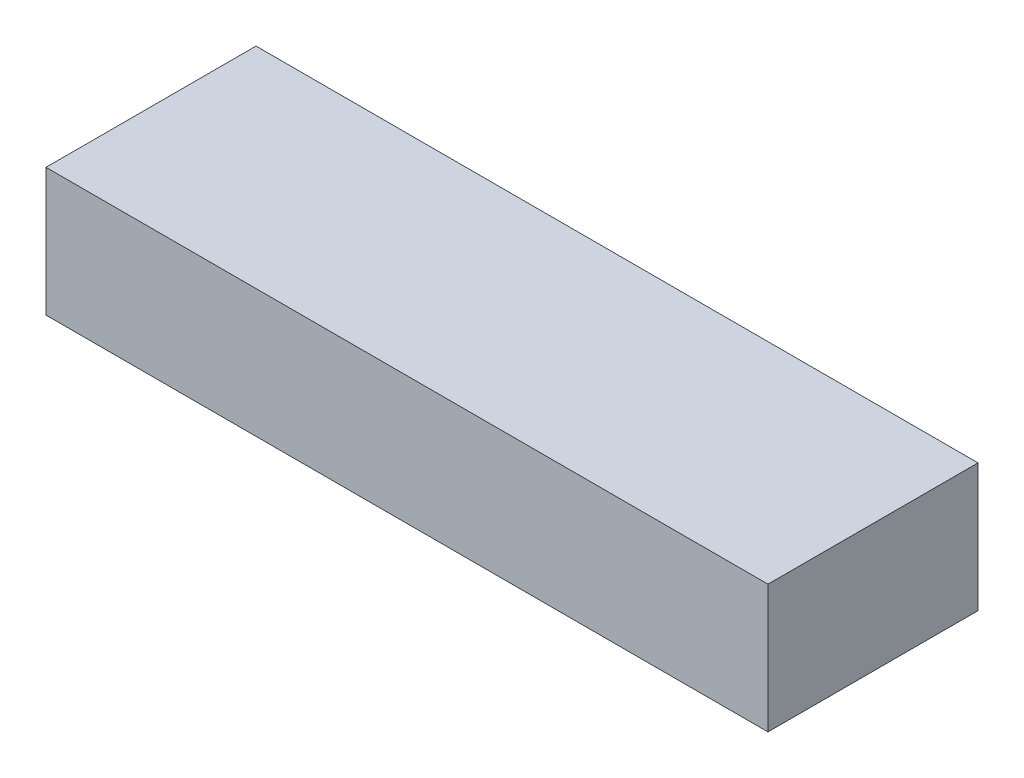
ISO-10303-21;
HEADER;
FILE_DESCRIPTION(('STEP AP214'),'2;1');
FILE_NAME('part.step','',(''),(''),'','','');
FILE_SCHEMA(('AUTOMOTIVE_DESIGN { 1 0 10303 214 1 1 1 1 }'));
ENDSEC;
DATA;
#1=APPLICATION_CONTEXT('core data for automotive mechanical design processes');
#2=APPLICATION_PROTOCOL_DEFINITION('international standard','automotive_design',2000,#1);
#3=PRODUCT_CONTEXT('',#1,'mechanical');
#4=PRODUCT('Part','Part','',(#3));
#5=PRODUCT_RELATED_PRODUCT_CATEGORY('part','',(#4));
#6=PRODUCT_DEFINITION_FORMATION('','',#4);
#7=PRODUCT_DEFINITION_CONTEXT('part definition',#1,'design');
#8=PRODUCT_DEFINITION('design','',#6,#7);
#9=PRODUCT_DEFINITION_SHAPE('','',#8);
#10=(LENGTH_UNIT() NAMED_UNIT(*) SI_UNIT(.MILLI.,.METRE.));
#11=(NAMED_UNIT(*) PLANE_ANGLE_UNIT() SI_UNIT($,.RADIAN.));
#12=(NAMED_UNIT(*) SI_UNIT($,.STERADIAN.) SOLID_ANGLE_UNIT());
#13=UNCERTAINTY_MEASURE_WITH_UNIT(LENGTH_MEASURE(1.E-05),#10,'distance_accuracy_value','');
#14=(GEOMETRIC_REPRESENTATION_CONTEXT(3) GLOBAL_UNCERTAINTY_ASSIGNED_CONTEXT((#13)) GLOBAL_UNIT_ASSIGNED_CONTEXT((#10,
#11,#12)) REPRESENTATION_CONTEXT('',''));
#15=CARTESIAN_POINT('',(0.,0.,0.));
#16=DIRECTION('',(0.,0.,1.));
#17=DIRECTION('',(1.,0.,0.));
#18=AXIS2_PLACEMENT_3D('',#15,#16,#17);
#19=CARTESIAN_POINT('',(0.,3.9,0.));
#20=DIRECTION('',(1.,0.,0.));
#21=DIRECTION('',(0.,0.,-1.));
#22=AXIS2_PLACEMENT_3D('',#19,#20,#21);
#23=PLANE('',#22);
#24=DIRECTION('',(0.,0.,1.));
#25=VECTOR('',#24,1.);
#26=CARTESIAN_POINT('',(0.,0.,0.));
#27=LINE('',#26,#25);
#28=CARTESIAN_POINT('',(0.,0.,-6.4));
#29=VERTEX_POINT('',#28);
#30=CARTESIAN_POINT('',(0.,0.,0.));
#31=VERTEX_POINT('',#30);
#32=EDGE_CURVE('E96',#29,#31,#27,.T.);
#33=ORIENTED_EDGE('',*,*,#32,.T.);
#34=DIRECTION('',(0.,-1.,0.));
#35=VECTOR('',#34,1.);
#36=CARTESIAN_POINT('',(0.,3.9,0.));
#37=LINE('',#36,#35);
#38=CARTESIAN_POINT('',(0.,3.9,0.));
#39=VERTEX_POINT('',#38);
#40=EDGE_CURVE('E11',#39,#31,#37,.T.);
#41=ORIENTED_EDGE('',*,*,#40,.F.);
#42=DIRECTION('',(0.,0.,1.));
#43=VECTOR('',#42,1.);
#44=CARTESIAN_POINT('',(0.,3.9,0.));
#45=LINE('',#44,#43);
#46=CARTESIAN_POINT('',(0.,3.9,-6.4));
#47=VERTEX_POINT('',#46);
#48=EDGE_CURVE('E84',#47,#39,#45,.T.);
#49=ORIENTED_EDGE('',*,*,#48,.F.);
#50=DIRECTION('',(0.,-1.,0.));
#51=VECTOR('',#50,1.);
#52=CARTESIAN_POINT('',(0.,3.9,-6.4));
#53=LINE('',#52,#51);
#54=EDGE_CURVE('E92',#47,#29,#53,.T.);
#55=ORIENTED_EDGE('',*,*,#54,.T.);
#56=EDGE_LOOP('',(#33,#41,#49,#55));
#57=FACE_BOUND('',#56,.T.);
#58=ADVANCED_FACE('F33',(#57),#23,.F.);
#59=CARTESIAN_POINT('',(0.,3.9,0.));
#60=DIRECTION('',(0.,0.,-1.));
#61=DIRECTION('',(-1.,0.,0.));
#62=AXIS2_PLACEMENT_3D('',#59,#60,#61);
#63=PLANE('',#62);
#64=DIRECTION('',(1.,0.,0.));
#65=VECTOR('',#64,1.);
#66=CARTESIAN_POINT('',(0.,0.,0.));
#67=LINE('',#66,#65);
#68=CARTESIAN_POINT('',(22.,0.,0.));
#69=VERTEX_POINT('',#68);
#70=EDGE_CURVE('E88',#31,#69,#67,.T.);
#71=ORIENTED_EDGE('',*,*,#70,.T.);
#72=DIRECTION('',(0.,-1.,0.));
#73=VECTOR('',#72,1.);
#74=CARTESIAN_POINT('',(22.,3.9,0.));
#75=LINE('',#74,#73);
#76=CARTESIAN_POINT('',(22.,3.9,0.));
#77=VERTEX_POINT('',#76);
#78=EDGE_CURVE('E41',#77,#69,#75,.T.);
#79=ORIENTED_EDGE('',*,*,#78,.F.);
#80=DIRECTION('',(1.,0.,0.));
#81=VECTOR('',#80,1.);
#82=CARTESIAN_POINT('',(0.,3.9,0.));
#83=LINE('',#82,#81);
#84=EDGE_CURVE('E79',#39,#77,#83,.T.);
#85=ORIENTED_EDGE('',*,*,#84,.F.);
#86=ORIENTED_EDGE('',*,*,#40,.T.);
#87=EDGE_LOOP('',(#71,#79,#85,#86));
#88=FACE_BOUND('',#87,.T.);
#89=ADVANCED_FACE('F87',(#88),#63,.F.);
#90=CARTESIAN_POINT('',(22.,3.9,0.));
#91=DIRECTION('',(-1.,0.,0.));
#92=DIRECTION('',(0.,0.,1.));
#93=AXIS2_PLACEMENT_3D('',#90,#91,#92);
#94=PLANE('',#93);
#95=DIRECTION('',(0.,0.,-1.));
#96=VECTOR('',#95,1.);
#97=CARTESIAN_POINT('',(22.,0.,0.));
#98=LINE('',#97,#96);
#99=CARTESIAN_POINT('',(22.,0.,-6.4));
#100=VERTEX_POINT('',#99);
#101=EDGE_CURVE('E66',#69,#100,#98,.T.);
#102=ORIENTED_EDGE('',*,*,#101,.T.);
#103=DIRECTION('',(0.,-1.,0.));
#104=VECTOR('',#103,1.);
#105=CARTESIAN_POINT('',(22.,3.9,-6.4));
#106=LINE('',#105,#104);
#107=CARTESIAN_POINT('',(22.,3.9,-6.4));
#108=VERTEX_POINT('',#107);
#109=EDGE_CURVE('E89',#108,#100,#106,.T.);
#110=ORIENTED_EDGE('',*,*,#109,.F.);
#111=DIRECTION('',(0.,0.,-1.));
#112=VECTOR('',#111,1.);
#113=CARTESIAN_POINT('',(22.,3.9,0.));
#114=LINE('',#113,#112);
#115=EDGE_CURVE('E82',#77,#108,#114,.T.);
#116=ORIENTED_EDGE('',*,*,#115,.F.);
#117=ORIENTED_EDGE('',*,*,#78,.T.);
#118=EDGE_LOOP('',(#102,#110,#116,#117));
#119=FACE_BOUND('',#118,.T.);
#120=ADVANCED_FACE('F90',(#119),#94,.F.);
#121=CARTESIAN_POINT('',(0.,3.9,-6.4));
#122=DIRECTION('',(0.,0.,1.));
#123=DIRECTION('',(1.,0.,0.));
#124=AXIS2_PLACEMENT_3D('',#121,#122,#123);
#125=PLANE('',#124);
#126=DIRECTION('',(-1.,0.,0.));
#127=VECTOR('',#126,1.);
#128=CARTESIAN_POINT('',(0.,0.,-6.4));
#129=LINE('',#128,#127);
#130=EDGE_CURVE('E72',#100,#29,#129,.T.);
#131=ORIENTED_EDGE('',*,*,#130,.T.);
#132=ORIENTED_EDGE('',*,*,#54,.F.);
#133=DIRECTION('',(-1.,0.,0.));
#134=VECTOR('',#133,1.);
#135=CARTESIAN_POINT('',(0.,3.9,-6.4));
#136=LINE('',#135,#134);
#137=EDGE_CURVE('E49',#108,#47,#136,.T.);
#138=ORIENTED_EDGE('',*,*,#137,.F.);
#139=ORIENTED_EDGE('',*,*,#109,.T.);
#140=EDGE_LOOP('',(#131,#132,#138,#139));
#141=FACE_BOUND('',#140,.T.);
#142=ADVANCED_FACE('F103',(#141),#125,.F.);
#143=CARTESIAN_POINT('',(0.,3.9,0.));
#144=DIRECTION('',(0.,-1.,0.));
#145=DIRECTION('',(0.,0.,-1.));
#146=AXIS2_PLACEMENT_3D('',#143,#144,#145);
#147=PLANE('',#146);
#148=ORIENTED_EDGE('',*,*,#48,.T.);
#149=ORIENTED_EDGE('',*,*,#84,.T.);
#150=ORIENTED_EDGE('',*,*,#115,.T.);
#151=ORIENTED_EDGE('',*,*,#137,.T.);
#152=EDGE_LOOP('',(#148,#149,#150,#151));
#153=FACE_BOUND('',#152,.T.);
#154=ADVANCED_FACE('F80',(#153),#147,.F.);
#155=CARTESIAN_POINT('',(0.,0.,0.));
#156=DIRECTION('',(0.,-1.,0.));
#157=DIRECTION('',(0.,0.,-1.));
#158=AXIS2_PLACEMENT_3D('',#155,#156,#157);
#159=PLANE('',#158);
#160=ORIENTED_EDGE('',*,*,#32,.F.);
#161=ORIENTED_EDGE('',*,*,#130,.F.);
#162=ORIENTED_EDGE('',*,*,#101,.F.);
#163=ORIENTED_EDGE('',*,*,#70,.F.);
#164=EDGE_LOOP('',(#160,#161,#162,#163));
#165=FACE_BOUND('',#164,.T.);
#166=ADVANCED_FACE('F106',(#165),#159,.T.);
#167=CLOSED_SHELL('',(#58,#89,#120,#142,#154,#166));
#168=MANIFOLD_SOLID_BREP('B2',#167);
#169=ADVANCED_BREP_SHAPE_REPRESENTATION('',(#18,#168),#14);
#170=SHAPE_DEFINITION_REPRESENTATION(#9,#169);
ENDSEC;
END-ISO-10303-21;
